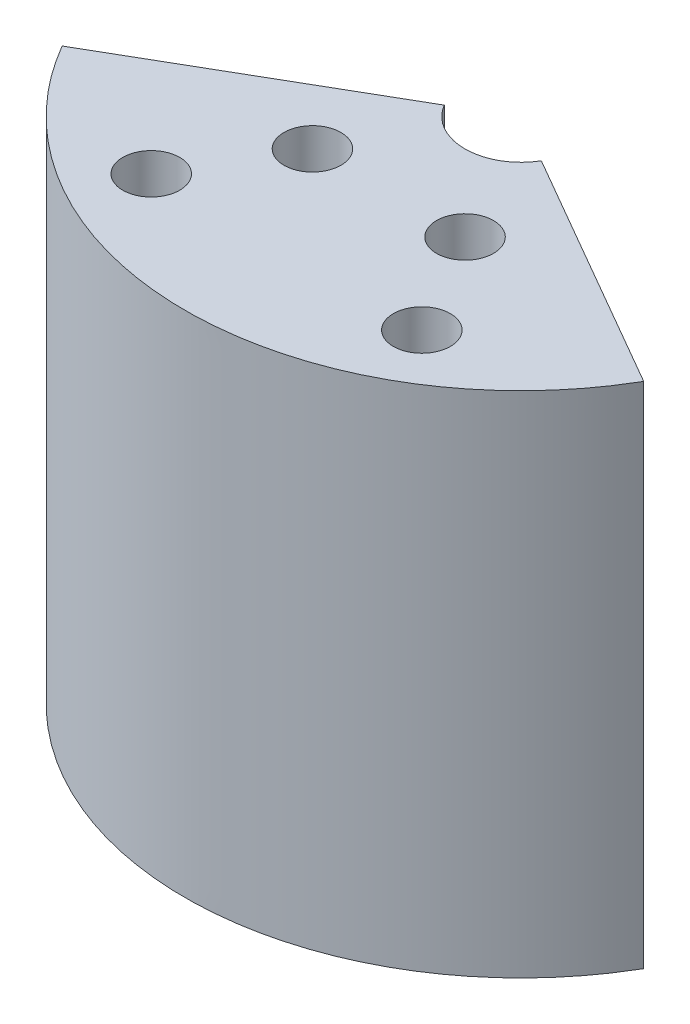
ISO-10303-21;
HEADER;
FILE_DESCRIPTION(('STEP AP214'),'2;1');
FILE_NAME('part.step','',(''),(''),'','','');
FILE_SCHEMA(('AUTOMOTIVE_DESIGN { 1 0 10303 214 1 1 1 1 }'));
ENDSEC;
DATA;
#1=APPLICATION_CONTEXT('core data for automotive mechanical design processes');
#2=APPLICATION_PROTOCOL_DEFINITION('international standard','automotive_design',2000,#1);
#3=PRODUCT_CONTEXT('',#1,'mechanical');
#4=PRODUCT('Part','Part','',(#3));
#5=PRODUCT_RELATED_PRODUCT_CATEGORY('part','',(#4));
#6=PRODUCT_DEFINITION_FORMATION('','',#4);
#7=PRODUCT_DEFINITION_CONTEXT('part definition',#1,'design');
#8=PRODUCT_DEFINITION('design','',#6,#7);
#9=PRODUCT_DEFINITION_SHAPE('','',#8);
#10=(LENGTH_UNIT() NAMED_UNIT(*) SI_UNIT(.MILLI.,.METRE.));
#11=(NAMED_UNIT(*) PLANE_ANGLE_UNIT() SI_UNIT($,.RADIAN.));
#12=(NAMED_UNIT(*) SI_UNIT($,.STERADIAN.) SOLID_ANGLE_UNIT());
#13=UNCERTAINTY_MEASURE_WITH_UNIT(LENGTH_MEASURE(1.E-05),#10,'distance_accuracy_value','');
#14=(GEOMETRIC_REPRESENTATION_CONTEXT(3) GLOBAL_UNCERTAINTY_ASSIGNED_CONTEXT((#13)) GLOBAL_UNIT_ASSIGNED_CONTEXT((#10,
#11,#12)) REPRESENTATION_CONTEXT('',''));
#15=CARTESIAN_POINT('',(0.,0.,0.));
#16=DIRECTION('',(0.,0.,1.));
#17=DIRECTION('',(1.,0.,0.));
#18=AXIS2_PLACEMENT_3D('',#15,#16,#17);
#19=CARTESIAN_POINT('',(-33.25,-123.736,57.591));
#20=DIRECTION('',(0.,1.,0.));
#21=DIRECTION('',(0.,0.,1.));
#22=AXIS2_PLACEMENT_3D('',#19,#20,#21);
#23=CYLINDRICAL_SURFACE('',#22,6.99984599830596);
#24=CARTESIAN_POINT('',(-33.25,-123.736,57.591));
#25=DIRECTION('',(0.,-1.,0.));
#26=DIRECTION('',(0.,0.,-1.));
#27=AXIS2_PLACEMENT_3D('',#24,#25,#26);
#28=CIRCLE('',#27,6.99984599830596);
#29=CARTESIAN_POINT('',(-33.25,-123.736,50.591154001694));
#30=VERTEX_POINT('',#29);
#31=EDGE_CURVE('E193',#30,#30,#28,.T.);
#32=ORIENTED_EDGE('',*,*,#31,.T.);
#33=EDGE_LOOP('',(#32));
#34=FACE_BOUND('',#33,.T.);
#35=CARTESIAN_POINT('',(-33.25,1.25599999999999,57.591));
#36=DIRECTION('',(0.,1.,0.));
#37=DIRECTION('',(-1.,0.,0.));
#38=AXIS2_PLACEMENT_3D('',#35,#36,#37);
#39=CIRCLE('',#38,6.99984599830596);
#40=CARTESIAN_POINT('',(-40.249845998306,1.25599999999999,57.591));
#41=VERTEX_POINT('',#40);
#42=EDGE_CURVE('E177',#41,#41,#39,.T.);
#43=ORIENTED_EDGE('',*,*,#42,.T.);
#44=EDGE_LOOP('',(#43));
#45=FACE_BOUND('',#44,.T.);
#46=ADVANCED_FACE('F32',(#34,#45),#23,.F.);
#47=CARTESIAN_POINT('',(-71.3969998447384,-123.736,41.336602450738));
#48=DIRECTION('',(0.500001552615496,0.,0.866024507379608));
#49=DIRECTION('',(0.866024507379608,0.,-0.500001552615496));
#50=AXIS2_PLACEMENT_3D('',#47,#48,#49);
#51=PLANE('',#50);
#52=DIRECTION('',(-0.866024507379608,0.,0.500001552615496));
#53=VECTOR('',#52,1.);
#54=CARTESIAN_POINT('',(-71.3969998447385,1.25599999999999,41.336602450738));
#55=LINE('',#54,#53);
#56=CARTESIAN_POINT('',(-11.8561941979281,1.25600000000001,6.96055995574969));
#57=VERTEX_POINT('',#56);
#58=CARTESIAN_POINT('',(-71.395189014518,1.25599999999998,41.3355569630941));
#59=VERTEX_POINT('',#58);
#60=EDGE_CURVE('E101',#57,#59,#55,.T.);
#61=ORIENTED_EDGE('',*,*,#60,.F.);
#62=DIRECTION('',(0.,1.,0.));
#63=VECTOR('',#62,1.);
#64=CARTESIAN_POINT('',(-11.8561941981069,-123.736,6.96055995585292));
#65=LINE('',#64,#63);
#66=CARTESIAN_POINT('',(-11.8561941979281,-123.736,6.96055995574969));
#67=VERTEX_POINT('',#66);
#68=EDGE_CURVE('E36',#67,#57,#65,.T.);
#69=ORIENTED_EDGE('',*,*,#68,.F.);
#70=DIRECTION('',(0.866024507379608,0.,-0.500001552615496));
#71=VECTOR('',#70,1.);
#72=CARTESIAN_POINT('',(-71.3969998447384,-123.736,41.336602450738));
#73=LINE('',#72,#71);
#74=CARTESIAN_POINT('',(-71.395189014518,-123.736,41.3355569630941));
#75=VERTEX_POINT('',#74);
#76=EDGE_CURVE('E41',#75,#67,#73,.T.);
#77=ORIENTED_EDGE('',*,*,#76,.F.);
#78=DIRECTION('',(0.,1.,0.));
#79=VECTOR('',#78,1.);
#80=CARTESIAN_POINT('',(-71.395189014518,-61.2399999999999,41.3355569630941));
#81=LINE('',#80,#79);
#82=EDGE_CURVE('E95',#75,#59,#81,.T.);
#83=ORIENTED_EDGE('',*,*,#82,.T.);
#84=EDGE_LOOP('',(#61,#69,#77,#83));
#85=FACE_BOUND('',#84,.T.);
#86=ADVANCED_FACE('F34',(#85),#51,.F.);
#87=CARTESIAN_POINT('',(71.447,-123.736,41.25));
#88=CARTESIAN_POINT('',(70.4179784412917,-123.736,42.9492691991551));
#89=CARTESIAN_POINT('',(68.3601225616234,-123.736,46.3474984034197));
#90=CARTESIAN_POINT('',(64.8175316162057,-123.736,51.1464276983898));
#91=CARTESIAN_POINT('',(60.9633721752455,-123.736,55.6937957428081));
#92=CARTESIAN_POINT('',(56.784268218965,-123.736,59.9470190573319));
#93=CARTESIAN_POINT('',(52.3103170379407,-123.736,63.8873868401639));
#94=CARTESIAN_POINT('',(47.5641506642531,-123.736,67.4956768649826));
#95=CARTESIAN_POINT('',(42.5700874237951,-123.736,70.7526081931362));
#96=CARTESIAN_POINT('',(37.3536374394381,-123.736,73.6398244219125));
#97=CARTESIAN_POINT('',(31.9426945070306,-123.736,76.1434120966261));
#98=CARTESIAN_POINT('',(26.3648697660876,-123.736,78.2488191827297));
#99=CARTESIAN_POINT('',(20.6500633584446,-123.736,79.9472428229244));
#100=CARTESIAN_POINT('',(14.827753312135,-123.736,81.2299744352066));
#101=CARTESIAN_POINT('',(8.92753089676732,-123.736,82.0871009758009));
#102=CARTESIAN_POINT('',(2.98111809599237,-123.736,82.517756601325));
#103=CARTESIAN_POINT('',(-2.98111809599237,-123.736,82.517756601325));
#104=CARTESIAN_POINT('',(-8.92753089676732,-123.736,82.0871009758009));
#105=CARTESIAN_POINT('',(-14.827753312135,-123.736,81.2299744352066));
#106=CARTESIAN_POINT('',(-20.6500633584446,-123.736,79.9472428229244));
#107=CARTESIAN_POINT('',(-26.3648697660876,-123.736,78.2488191827297));
#108=CARTESIAN_POINT('',(-31.9426945070306,-123.736,76.1434120966261));
#109=CARTESIAN_POINT('',(-37.3536374394382,-123.736,73.6398244219125));
#110=CARTESIAN_POINT('',(-42.5700874237951,-123.736,70.7526081931362));
#111=CARTESIAN_POINT('',(-47.5641506642531,-123.736,67.4956768649826));
#112=CARTESIAN_POINT('',(-52.3103170379407,-123.736,63.8873868401639));
#113=CARTESIAN_POINT('',(-56.784268218965,-123.736,59.9470190573319));
#114=CARTESIAN_POINT('',(-60.9633721752455,-123.736,55.6937957428081));
#115=CARTESIAN_POINT('',(-64.8175316162057,-123.736,51.1464276983898));
#116=CARTESIAN_POINT('',(-68.3601225616235,-123.736,46.3474984034197));
#117=CARTESIAN_POINT('',(-70.4179784412917,-123.736,42.9492691991551));
#118=CARTESIAN_POINT('',(-71.447,-123.736,41.25));
#119=B_SPLINE_CURVE_WITH_KNOTS('',3,(#87,#88,#89,#90,#91,#92,#93,#94,#95,#96,#97,#98,#99,#100,
#101,#102,#103,#104,#105,#106,#107,#108,#109,#110,#111,#112,#113,#114,#115,#116,#117,#118),
.UNSPECIFIED.,.F.,.F.,(4,1,1,1,1,1,1,1,1,1,1,1,1,1,1,1,1,1,1,1,1,1,1,1,1,1,1,1,1,4),(0.,
0.0344839191298283,0.0689615636667485,0.103450465991406,0.137933366239594,0.172414368090567,
0.206896205696217,0.241380971684728,0.275865520494595,0.310346020883038,0.344829100421595,
0.379311579406632,0.413791405821834,0.448274645214702,0.482761183563026,0.517238816436974,
0.551725354785297,0.586208594178166,0.620688420593368,0.655170899578405,0.689653979116962,
0.724134479505404,0.758619028315272,0.793103794303783,0.827585631909433,0.862066633760406,
0.896549534008594,0.931038436333251,0.965516080870172,1.),.UNSPECIFIED.);
#120=DIRECTION('',(0.,1.,0.));
#121=VECTOR('',#120,1.);
#122=SURFACE_OF_LINEAR_EXTRUSION('',#119,#121);
#123=CARTESIAN_POINT('',(71.447,1.25599999999998,41.25));
#124=CARTESIAN_POINT('',(70.4179784412917,1.25599999999999,42.9492691991551));
#125=CARTESIAN_POINT('',(68.3601225616234,1.25599999999999,46.3474984034197));
#126=CARTESIAN_POINT('',(64.8175316162057,1.25599999999994,51.1464276983898));
#127=CARTESIAN_POINT('',(60.9633721752455,1.25600000000001,55.6937957428081));
#128=CARTESIAN_POINT('',(56.784268218965,1.25599999999999,59.9470190573319));
#129=CARTESIAN_POINT('',(52.3103170379407,1.25599999999997,63.8873868401639));
#130=CARTESIAN_POINT('',(47.5641506642531,1.25599999999995,67.4956768649826));
#131=CARTESIAN_POINT('',(42.5700874237951,1.25599999999997,70.7526081931362));
#132=CARTESIAN_POINT('',(37.3536374394381,1.25600000000001,73.6398244219125));
#133=CARTESIAN_POINT('',(31.9426945070306,1.25599999999999,76.1434120966261));
#134=CARTESIAN_POINT('',(26.3648697660876,1.25599999999997,78.2488191827297));
#135=CARTESIAN_POINT('',(20.6500633584446,1.25599999999999,79.9472428229244));
#136=CARTESIAN_POINT('',(14.827753312135,1.25599999999999,81.2299744352066));
#137=CARTESIAN_POINT('',(8.92753089676732,1.25599999999994,82.0871009758009));
#138=CARTESIAN_POINT('',(2.98111809599237,1.25599999999999,82.517756601325));
#139=CARTESIAN_POINT('',(-2.98111809599237,1.25599999999997,82.517756601325));
#140=CARTESIAN_POINT('',(-8.92753089676732,1.25599999999997,82.0871009758009));
#141=CARTESIAN_POINT('',(-14.827753312135,1.25599999999998,81.2299744352066));
#142=CARTESIAN_POINT('',(-20.6500633584446,1.25599999999995,79.9472428229244));
#143=CARTESIAN_POINT('',(-26.3648697660876,1.25600000000002,78.2488191827297));
#144=CARTESIAN_POINT('',(-31.9426945070306,1.25600000000001,76.1434120966261));
#145=CARTESIAN_POINT('',(-37.3536374394382,1.25599999999995,73.6398244219125));
#146=CARTESIAN_POINT('',(-42.5700874237951,1.25599999999999,70.7526081931362));
#147=CARTESIAN_POINT('',(-47.5641506642531,1.25599999999995,67.4956768649826));
#148=CARTESIAN_POINT('',(-52.3103170379407,1.25599999999995,63.8873868401639));
#149=CARTESIAN_POINT('',(-56.784268218965,1.25599999999998,59.9470190573319));
#150=CARTESIAN_POINT('',(-60.9633721752455,1.25599999999998,55.6937957428081));
#151=CARTESIAN_POINT('',(-64.8175316162057,1.25600000000002,51.1464276983898));
#152=CARTESIAN_POINT('',(-68.3601225616235,1.25599999999994,46.3474984034197));
#153=CARTESIAN_POINT('',(-70.4179784412917,1.25599999999997,42.9492691991551));
#154=CARTESIAN_POINT('',(-71.447,1.25599999999998,41.25));
#155=B_SPLINE_CURVE_WITH_KNOTS('',3,(#123,#124,#125,#126,#127,#128,#129,#130,#131,#132,#133,
#134,#135,#136,#137,#138,#139,#140,#141,#142,#143,#144,#145,#146,#147,#148,#149,#150,#151,#152,
#153,#154),.UNSPECIFIED.,.F.,.F.,(4,1,1,1,1,1,1,1,1,1,1,1,1,1,1,1,1,1,1,1,1,1,1,1,1,1,1,1,1,4),
(0.,0.0344839191298283,0.0689615636667485,0.103450465991406,0.137933366239594,0.172414368090567,
0.206896205696217,0.241380971684728,0.275865520494595,0.310346020883038,0.344829100421595,
0.379311579406632,0.413791405821834,0.448274645214702,0.482761183563026,0.517238816436974,
0.551725354785297,0.586208594178166,0.620688420593368,0.655170899578405,0.689653979116962,
0.724134479505404,0.758619028315272,0.793103794303783,0.827585631909433,0.862066633760406,
0.896549534008594,0.931038436333251,0.965516080870172,1.),.UNSPECIFIED.);
#156=CARTESIAN_POINT('',(71.4418189382431,1.25599999999998,41.258555717551));
#157=VERTEX_POINT('',#156);
#158=EDGE_CURVE('E96',#59,#157,#155,.F.);
#159=ORIENTED_EDGE('',*,*,#158,.F.);
#160=ORIENTED_EDGE('',*,*,#82,.F.);
#161=CARTESIAN_POINT('',(71.4418189382431,-123.736,41.258555717551));
#162=VERTEX_POINT('',#161);
#163=EDGE_CURVE('E11',#162,#75,#119,.T.);
#164=ORIENTED_EDGE('',*,*,#163,.F.);
#165=DIRECTION('',(0.,1.,0.));
#166=VECTOR('',#165,1.);
#167=CARTESIAN_POINT('',(71.4418189382431,-61.2399999999863,41.2585557175509));
#168=LINE('',#167,#166);
#169=EDGE_CURVE('E82',#162,#157,#168,.T.);
#170=ORIENTED_EDGE('',*,*,#169,.T.);
#171=EDGE_LOOP('',(#159,#160,#164,#170));
#172=FACE_BOUND('',#171,.T.);
#173=ADVANCED_FACE('F94',(#172),#122,.F.);
#174=CARTESIAN_POINT('',(11.908,-123.736,6.875));
#175=CARTESIAN_POINT('',(11.7366156273442,-123.736,7.15815049054757));
#176=CARTESIAN_POINT('',(11.3937459960641,-123.736,7.72461814910006));
#177=CARTESIAN_POINT('',(10.8023525761079,-123.736,8.52353002394046));
#178=CARTESIAN_POINT('',(10.1613750644199,-123.736,9.28259600836447));
#179=CARTESIAN_POINT('',(9.46376369961801,-123.736,9.99048751098942));
#180=CARTESIAN_POINT('',(8.71883966135122,-123.736,10.6481602295829));
#181=CARTESIAN_POINT('',(7.92790824386578,-123.736,11.2500288289471));
#182=CARTESIAN_POINT('',(7.09497561642224,-123.736,11.7920987309621));
#183=CARTESIAN_POINT('',(6.2257995279889,-123.736,12.2738270176543));
#184=CARTESIAN_POINT('',(5.32328208697905,-123.736,12.6898495782074));
#185=CARTESIAN_POINT('',(4.39409998888104,-123.736,13.0411824892666));
#186=CARTESIAN_POINT('',(3.4417651773478,-123.736,13.324929470653));
#187=CARTESIAN_POINT('',(2.47134212385895,-123.736,13.5374844444431));
#188=CARTESIAN_POINT('',(1.48789009038564,-123.736,13.6809419106778));
#189=CARTESIAN_POINT('',(0.496971484172793,-123.736,13.7529903970947));
#190=CARTESIAN_POINT('',(-0.496971484172793,-123.736,13.7529903970947));
#191=CARTESIAN_POINT('',(-1.48789009038564,-123.736,13.6809419106778));
#192=CARTESIAN_POINT('',(-2.47134212385894,-123.736,13.5374844444431));
#193=CARTESIAN_POINT('',(-3.44176517734781,-123.736,13.324929470653));
#194=CARTESIAN_POINT('',(-4.39409998888103,-123.736,13.0411824892666));
#195=CARTESIAN_POINT('',(-5.32328208697906,-123.736,12.6898495782074));
#196=CARTESIAN_POINT('',(-6.22579952798889,-123.736,12.2738270176543));
#197=CARTESIAN_POINT('',(-7.09497561642224,-123.736,11.7920987309621));
#198=CARTESIAN_POINT('',(-7.92790824386578,-123.736,11.2500288289471));
#199=CARTESIAN_POINT('',(-8.71883966135122,-123.736,10.648160229583));
#200=CARTESIAN_POINT('',(-9.46376369961801,-123.736,9.99048751098942));
#201=CARTESIAN_POINT('',(-10.1613750644199,-123.736,9.28259600836447));
#202=CARTESIAN_POINT('',(-10.8023525761079,-123.736,8.52353002394047));
#203=CARTESIAN_POINT('',(-11.3937459960641,-123.736,7.72461814910006));
#204=CARTESIAN_POINT('',(-11.7366156273442,-123.736,7.15815049054756));
#205=CARTESIAN_POINT('',(-11.908,-123.736,6.875));
#206=B_SPLINE_CURVE_WITH_KNOTS('',3,(#174,#175,#176,#177,#178,#179,#180,#181,#182,#183,#184,
#185,#186,#187,#188,#189,#190,#191,#192,#193,#194,#195,#196,#197,#198,#199,#200,#201,#202,#203,
#204,#205),.UNSPECIFIED.,.F.,.F.,(4,1,1,1,1,1,1,1,1,1,1,1,1,1,1,1,1,1,1,1,1,1,1,1,1,1,1,1,1,4),
(0.,0.0344708882662089,0.0689620679329312,0.103436508056392,0.137919117812285,0.172419110023535,
0.206895089754669,0.241383086560245,0.275880421257061,0.310348632265819,0.344841071005323,
0.379302859248072,0.41379577012802,0.448262511181514,0.482772834283755,0.517227165716245,
0.551737488818486,0.58620422987198,0.620697140751928,0.655158928994677,0.689651367734181,
0.724119578742939,0.758616913439755,0.793104910245331,0.827580889976465,0.862080882187716,
0.896563491943608,0.931037932067069,0.965529111733791,1.),.UNSPECIFIED.);
#207=DIRECTION('',(0.,1.,0.));
#208=VECTOR('',#207,1.);
#209=SURFACE_OF_LINEAR_EXTRUSION('',#206,#208);
#210=ORIENTED_EDGE('',*,*,#68,.T.);
#211=CARTESIAN_POINT('',(11.908,1.25600000000001,6.875));
#212=CARTESIAN_POINT('',(11.7366156273442,1.25599999999999,7.15815049054757));
#213=CARTESIAN_POINT('',(11.3937459960641,1.25600000000001,7.72461814910006));
#214=CARTESIAN_POINT('',(10.8023525761079,1.25600000000003,8.52353002394046));
#215=CARTESIAN_POINT('',(10.1613750644199,1.25599999999999,9.28259600836447));
#216=CARTESIAN_POINT('',(9.46376369961801,1.25599999999999,9.99048751098942));
#217=CARTESIAN_POINT('',(8.71883966135122,1.25599999999998,10.6481602295829));
#218=CARTESIAN_POINT('',(7.92790824386578,1.25600000000002,11.2500288289471));
#219=CARTESIAN_POINT('',(7.09497561642224,1.25599999999999,11.7920987309621));
#220=CARTESIAN_POINT('',(6.2257995279889,1.25599999999997,12.2738270176543));
#221=CARTESIAN_POINT('',(5.32328208697905,1.25599999999999,12.6898495782074));
#222=CARTESIAN_POINT('',(4.39409998888104,1.25599999999999,13.0411824892666));
#223=CARTESIAN_POINT('',(3.4417651773478,1.25600000000002,13.324929470653));
#224=CARTESIAN_POINT('',(2.47134212385895,1.25600000000002,13.5374844444431));
#225=CARTESIAN_POINT('',(1.48789009038564,1.25600000000001,13.6809419106778));
#226=CARTESIAN_POINT('',(0.496971484172793,1.25599999999999,13.7529903970947));
#227=CARTESIAN_POINT('',(-0.496971484172793,1.25599999999998,13.7529903970947));
#228=CARTESIAN_POINT('',(-1.48789009038564,1.25599999999999,13.6809419106778));
#229=CARTESIAN_POINT('',(-2.47134212385894,1.25600000000001,13.5374844444431));
#230=CARTESIAN_POINT('',(-3.44176517734781,1.25600000000001,13.324929470653));
#231=CARTESIAN_POINT('',(-4.39409998888103,1.25600000000002,13.0411824892666));
#232=CARTESIAN_POINT('',(-5.32328208697906,1.25599999999998,12.6898495782074));
#233=CARTESIAN_POINT('',(-6.22579952798889,1.25600000000003,12.2738270176543));
#234=CARTESIAN_POINT('',(-7.09497561642224,1.25599999999997,11.7920987309621));
#235=CARTESIAN_POINT('',(-7.92790824386578,1.25600000000003,11.2500288289471));
#236=CARTESIAN_POINT('',(-8.71883966135122,1.25599999999998,10.648160229583));
#237=CARTESIAN_POINT('',(-9.46376369961801,1.25600000000001,9.99048751098942));
#238=CARTESIAN_POINT('',(-10.1613750644199,1.25600000000002,9.28259600836447));
#239=CARTESIAN_POINT('',(-10.8023525761079,1.25599999999997,8.52353002394047));
#240=CARTESIAN_POINT('',(-11.3937459960641,1.25600000000003,7.72461814910006));
#241=CARTESIAN_POINT('',(-11.7366156273442,1.25600000000003,7.15815049054756));
#242=CARTESIAN_POINT('',(-11.908,1.25600000000001,6.875));
#243=B_SPLINE_CURVE_WITH_KNOTS('',3,(#211,#212,#213,#214,#215,#216,#217,#218,#219,#220,#221,
#222,#223,#224,#225,#226,#227,#228,#229,#230,#231,#232,#233,#234,#235,#236,#237,#238,#239,#240,
#241,#242),.UNSPECIFIED.,.F.,.F.,(4,1,1,1,1,1,1,1,1,1,1,1,1,1,1,1,1,1,1,1,1,1,1,1,1,1,1,1,1,4),
(0.,0.0344708882662089,0.0689620679329312,0.103436508056392,0.137919117812285,0.172419110023535,
0.206895089754669,0.241383086560245,0.275880421257061,0.310348632265819,0.344841071005323,
0.379302859248072,0.41379577012802,0.448262511181514,0.482772834283755,0.517227165716245,
0.551737488818486,0.58620422987198,0.620697140751928,0.655158928994677,0.689651367734181,
0.724119578742939,0.758616913439755,0.793104910245331,0.827580889976465,0.862080882187716,
0.896563491943608,0.931037932067069,0.965529111733791,1.),.UNSPECIFIED.);
#244=CARTESIAN_POINT('',(11.9028207668082,1.25600000000001,6.88355677327791));
#245=VERTEX_POINT('',#244);
#246=EDGE_CURVE('E54',#57,#245,#243,.F.);
#247=ORIENTED_EDGE('',*,*,#246,.T.);
#248=DIRECTION('',(0.,1.,0.));
#249=VECTOR('',#248,1.);
#250=CARTESIAN_POINT('',(11.9028207668082,-61.240000000012,6.8835567732779));
#251=LINE('',#250,#249);
#252=CARTESIAN_POINT('',(11.9028207668082,-123.736,6.88355677327791));
#253=VERTEX_POINT('',#252);
#254=EDGE_CURVE('E81',#253,#245,#251,.T.);
#255=ORIENTED_EDGE('',*,*,#254,.F.);
#256=EDGE_CURVE('E73',#253,#67,#206,.T.);
#257=ORIENTED_EDGE('',*,*,#256,.T.);
#258=EDGE_LOOP('',(#210,#247,#255,#257));
#259=FACE_BOUND('',#258,.T.);
#260=ADVANCED_FACE('F137',(#259),#209,.T.);
#261=CARTESIAN_POINT('',(71.4419999844738,-123.736,41.2586602450738));
#262=DIRECTION('',(0.500001552615496,0.,-0.866024507379608));
#263=DIRECTION('',(-0.866024507379608,0.,-0.500001552615496));
#264=AXIS2_PLACEMENT_3D('',#261,#262,#263);
#265=PLANE('',#264);
#266=ORIENTED_EDGE('',*,*,#254,.T.);
#267=DIRECTION('',(0.866024507379608,0.,0.500001552615496));
#268=VECTOR('',#267,1.);
#269=CARTESIAN_POINT('',(71.4419999844738,1.25600000000001,41.2586602450738));
#270=LINE('',#269,#268);
#271=EDGE_CURVE('E87',#245,#157,#270,.T.);
#272=ORIENTED_EDGE('',*,*,#271,.T.);
#273=ORIENTED_EDGE('',*,*,#169,.F.);
#274=DIRECTION('',(-0.866024507379608,0.,-0.500001552615496));
#275=VECTOR('',#274,1.);
#276=CARTESIAN_POINT('',(71.4419999844738,-123.736,41.2586602450738));
#277=LINE('',#276,#275);
#278=EDGE_CURVE('E75',#162,#253,#277,.T.);
#279=ORIENTED_EDGE('',*,*,#278,.T.);
#280=EDGE_LOOP('',(#266,#272,#273,#279));
#281=FACE_BOUND('',#280,.T.);
#282=ADVANCED_FACE('F85',(#281),#265,.T.);
#283=CARTESIAN_POINT('',(-18.75,-123.736,32.476));
#284=DIRECTION('',(0.,1.,0.));
#285=DIRECTION('',(0.,0.,1.));
#286=AXIS2_PLACEMENT_3D('',#283,#284,#285);
#287=CYLINDRICAL_SURFACE('',#286,6.99984599830597);
#288=CARTESIAN_POINT('',(-18.75,-123.736,32.476));
#289=DIRECTION('',(0.,-1.,0.));
#290=DIRECTION('',(0.,0.,-1.));
#291=AXIS2_PLACEMENT_3D('',#288,#289,#290);
#292=CIRCLE('',#291,6.99984599830597);
#293=CARTESIAN_POINT('',(-18.75,-123.736,25.476154001694));
#294=VERTEX_POINT('',#293);
#295=EDGE_CURVE('E91',#294,#294,#292,.T.);
#296=ORIENTED_EDGE('',*,*,#295,.T.);
#297=EDGE_LOOP('',(#296));
#298=FACE_BOUND('',#297,.T.);
#299=CARTESIAN_POINT('',(-18.75,1.25599999999999,32.476));
#300=DIRECTION('',(0.,1.,0.));
#301=DIRECTION('',(-1.,0.,0.));
#302=AXIS2_PLACEMENT_3D('',#299,#300,#301);
#303=CIRCLE('',#302,6.99984599830597);
#304=CARTESIAN_POINT('',(-25.749845998306,1.25599999999999,32.476));
#305=VERTEX_POINT('',#304);
#306=EDGE_CURVE('E103',#305,#305,#303,.T.);
#307=ORIENTED_EDGE('',*,*,#306,.T.);
#308=EDGE_LOOP('',(#307));
#309=FACE_BOUND('',#308,.T.);
#310=ADVANCED_FACE('F144',(#298,#309),#287,.F.);
#311=CARTESIAN_POINT('',(18.75,-123.736,32.476));
#312=DIRECTION('',(0.,1.,0.));
#313=DIRECTION('',(0.,0.,1.));
#314=AXIS2_PLACEMENT_3D('',#311,#312,#313);
#315=CYLINDRICAL_SURFACE('',#314,6.99984599830597);
#316=CARTESIAN_POINT('',(18.75,-123.736,32.476));
#317=DIRECTION('',(0.,-1.,0.));
#318=DIRECTION('',(0.,0.,-1.));
#319=AXIS2_PLACEMENT_3D('',#316,#317,#318);
#320=CIRCLE('',#319,6.99984599830597);
#321=CARTESIAN_POINT('',(18.75,-123.736,25.476154001694));
#322=VERTEX_POINT('',#321);
#323=EDGE_CURVE('E190',#322,#322,#320,.T.);
#324=ORIENTED_EDGE('',*,*,#323,.T.);
#325=EDGE_LOOP('',(#324));
#326=FACE_BOUND('',#325,.T.);
#327=CARTESIAN_POINT('',(18.75,1.25599999999999,32.476));
#328=DIRECTION('',(0.,1.,0.));
#329=DIRECTION('',(-1.,0.,0.));
#330=AXIS2_PLACEMENT_3D('',#327,#328,#329);
#331=CIRCLE('',#330,6.99984599830597);
#332=CARTESIAN_POINT('',(11.750154001694,1.25599999999999,32.476));
#333=VERTEX_POINT('',#332);
#334=EDGE_CURVE('E121',#333,#333,#331,.T.);
#335=ORIENTED_EDGE('',*,*,#334,.T.);
#336=EDGE_LOOP('',(#335));
#337=FACE_BOUND('',#336,.T.);
#338=ADVANCED_FACE('F141',(#326,#337),#315,.F.);
#339=CARTESIAN_POINT('',(0.,-123.736,-83.9124205601942));
#340=DIRECTION('',(0.,-1.,0.));
#341=DIRECTION('',(0.,0.,-1.));
#342=AXIS2_PLACEMENT_3D('',#339,#340,#341);
#343=PLANE('',#342);
#344=ORIENTED_EDGE('',*,*,#323,.F.);
#345=EDGE_LOOP('',(#344));
#346=FACE_BOUND('',#345,.T.);
#347=ORIENTED_EDGE('',*,*,#295,.F.);
#348=EDGE_LOOP('',(#347));
#349=FACE_BOUND('',#348,.T.);
#350=ORIENTED_EDGE('',*,*,#278,.F.);
#351=ORIENTED_EDGE('',*,*,#163,.T.);
#352=ORIENTED_EDGE('',*,*,#76,.T.);
#353=ORIENTED_EDGE('',*,*,#256,.F.);
#354=EDGE_LOOP('',(#350,#351,#352,#353));
#355=FACE_BOUND('',#354,.T.);
#356=ORIENTED_EDGE('',*,*,#31,.F.);
#357=EDGE_LOOP('',(#356));
#358=FACE_BOUND('',#357,.T.);
#359=CARTESIAN_POINT('',(33.25,-123.736,57.591));
#360=DIRECTION('',(0.,-1.,0.));
#361=DIRECTION('',(0.,0.,-1.));
#362=AXIS2_PLACEMENT_3D('',#359,#360,#361);
#363=CIRCLE('',#362,6.99984599830596);
#364=CARTESIAN_POINT('',(33.25,-123.736,50.591154001694));
#365=VERTEX_POINT('',#364);
#366=EDGE_CURVE('E116',#365,#365,#363,.T.);
#367=ORIENTED_EDGE('',*,*,#366,.F.);
#368=EDGE_LOOP('',(#367));
#369=FACE_BOUND('',#368,.T.);
#370=ADVANCED_FACE('F77',(#346,#349,#355,#358,#369),#343,.T.);
#371=CARTESIAN_POINT('',(33.25,-123.736,57.591));
#372=DIRECTION('',(0.,1.,0.));
#373=DIRECTION('',(0.,0.,1.));
#374=AXIS2_PLACEMENT_3D('',#371,#372,#373);
#375=CYLINDRICAL_SURFACE('',#374,6.99984599830596);
#376=ORIENTED_EDGE('',*,*,#366,.T.);
#377=EDGE_LOOP('',(#376));
#378=FACE_BOUND('',#377,.T.);
#379=CARTESIAN_POINT('',(33.25,1.25599999999999,57.591));
#380=DIRECTION('',(0.,1.,0.));
#381=DIRECTION('',(-1.,0.,0.));
#382=AXIS2_PLACEMENT_3D('',#379,#380,#381);
#383=CIRCLE('',#382,6.99984599830596);
#384=CARTESIAN_POINT('',(26.250154001694,1.25599999999999,57.591));
#385=VERTEX_POINT('',#384);
#386=EDGE_CURVE('E119',#385,#385,#383,.T.);
#387=ORIENTED_EDGE('',*,*,#386,.T.);
#388=EDGE_LOOP('',(#387));
#389=FACE_BOUND('',#388,.T.);
#390=ADVANCED_FACE('F140',(#378,#389),#375,.F.);
#391=CARTESIAN_POINT('',(0.,1.256,0.));
#392=DIRECTION('',(0.,1.,0.));
#393=DIRECTION('',(-1.,0.,0.));
#394=AXIS2_PLACEMENT_3D('',#391,#392,#393);
#395=PLANE('',#394);
#396=ORIENTED_EDGE('',*,*,#271,.F.);
#397=ORIENTED_EDGE('',*,*,#246,.F.);
#398=ORIENTED_EDGE('',*,*,#60,.T.);
#399=ORIENTED_EDGE('',*,*,#158,.T.);
#400=EDGE_LOOP('',(#396,#397,#398,#399));
#401=FACE_BOUND('',#400,.T.);
#402=ORIENTED_EDGE('',*,*,#306,.F.);
#403=EDGE_LOOP('',(#402));
#404=FACE_BOUND('',#403,.T.);
#405=ORIENTED_EDGE('',*,*,#42,.F.);
#406=EDGE_LOOP('',(#405));
#407=FACE_BOUND('',#406,.T.);
#408=ORIENTED_EDGE('',*,*,#334,.F.);
#409=EDGE_LOOP('',(#408));
#410=FACE_BOUND('',#409,.T.);
#411=ORIENTED_EDGE('',*,*,#386,.F.);
#412=EDGE_LOOP('',(#411));
#413=FACE_BOUND('',#412,.T.);
#414=ADVANCED_FACE('F164',(#401,#404,#407,#410,#413),#395,.T.);
#415=CLOSED_SHELL('',(#46,#86,#173,#260,#282,#310,#338,#370,#390,#414));
#416=MANIFOLD_SOLID_BREP('B2',#415);
#417=ADVANCED_BREP_SHAPE_REPRESENTATION('',(#18,#416),#14);
#418=SHAPE_DEFINITION_REPRESENTATION(#9,#417);
ENDSEC;
END-ISO-10303-21;
